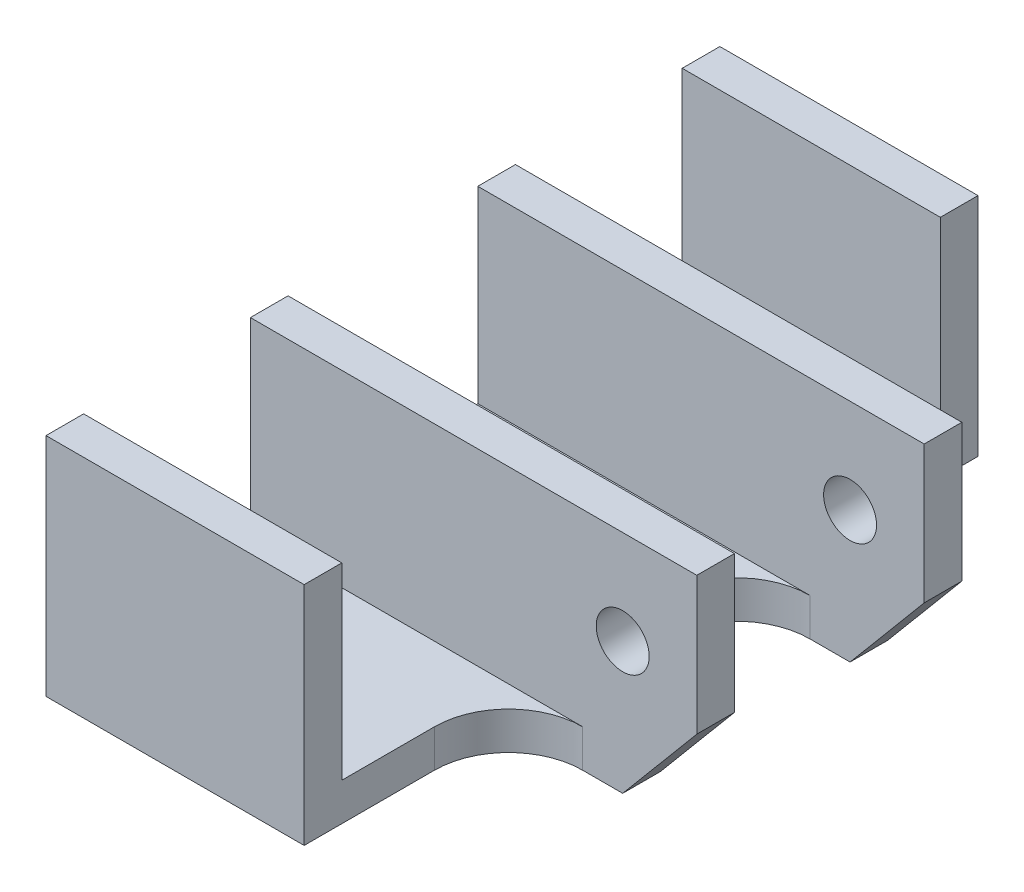
ISO-10303-21;
HEADER;
FILE_DESCRIPTION(('STEP AP214'),'2;1');
FILE_NAME('part.step','',(''),(''),'','','');
FILE_SCHEMA(('AUTOMOTIVE_DESIGN { 1 0 10303 214 1 1 1 1 }'));
ENDSEC;
DATA;
#1=APPLICATION_CONTEXT('core data for automotive mechanical design processes');
#2=APPLICATION_PROTOCOL_DEFINITION('international standard','automotive_design',2000,#1);
#3=PRODUCT_CONTEXT('',#1,'mechanical');
#4=PRODUCT('Part','Part','',(#3));
#5=PRODUCT_RELATED_PRODUCT_CATEGORY('part','',(#4));
#6=PRODUCT_DEFINITION_FORMATION('','',#4);
#7=PRODUCT_DEFINITION_CONTEXT('part definition',#1,'design');
#8=PRODUCT_DEFINITION('design','',#6,#7);
#9=PRODUCT_DEFINITION_SHAPE('','',#8);
#10=(LENGTH_UNIT() NAMED_UNIT(*) SI_UNIT(.MILLI.,.METRE.));
#11=(NAMED_UNIT(*) PLANE_ANGLE_UNIT() SI_UNIT($,.RADIAN.));
#12=(NAMED_UNIT(*) SI_UNIT($,.STERADIAN.) SOLID_ANGLE_UNIT());
#13=UNCERTAINTY_MEASURE_WITH_UNIT(LENGTH_MEASURE(1.E-05),#10,'distance_accuracy_value','');
#14=(GEOMETRIC_REPRESENTATION_CONTEXT(3) GLOBAL_UNCERTAINTY_ASSIGNED_CONTEXT((#13)) GLOBAL_UNIT_ASSIGNED_CONTEXT((#10,
#11,#12)) REPRESENTATION_CONTEXT('',''));
#15=CARTESIAN_POINT('',(0.,0.,0.));
#16=DIRECTION('',(0.,0.,1.));
#17=DIRECTION('',(1.,0.,0.));
#18=AXIS2_PLACEMENT_3D('',#15,#16,#17);
#19=CARTESIAN_POINT('',(34.83,0.,17.88));
#20=DIRECTION('',(0.,0.,-1.));
#21=DIRECTION('',(0.,1.,0.));
#22=AXIS2_PLACEMENT_3D('',#19,#20,#21);
#23=PLANE('',#22);
#24=DIRECTION('',(-1.,0.,0.));
#25=VECTOR('',#24,1.);
#26=CARTESIAN_POINT('',(34.83,0.,17.88));
#27=LINE('',#26,#25);
#28=CARTESIAN_POINT('',(44.83,0.,17.88));
#29=VERTEX_POINT('',#28);
#30=CARTESIAN_POINT('',(0.,0.,17.88));
#31=VERTEX_POINT('',#30);
#32=EDGE_CURVE('E340',#29,#31,#27,.T.);
#33=ORIENTED_EDGE('',*,*,#32,.F.);
#34=DIRECTION('',(0.,-1.,0.));
#35=VECTOR('',#34,1.);
#36=CARTESIAN_POINT('',(44.83,0.,17.88));
#37=LINE('',#36,#35);
#38=CARTESIAN_POINT('',(44.83,-5.08,17.88));
#39=VERTEX_POINT('',#38);
#40=EDGE_CURVE('E385',#29,#39,#37,.T.);
#41=ORIENTED_EDGE('',*,*,#40,.T.);
#42=DIRECTION('',(-1.,0.,0.));
#43=VECTOR('',#42,1.);
#44=CARTESIAN_POINT('',(60.23,-5.08,17.88));
#45=LINE('',#44,#43);
#46=CARTESIAN_POINT('',(50.23,-5.08,17.88));
#47=VERTEX_POINT('',#46);
#48=EDGE_CURVE('E252',#47,#39,#45,.T.);
#49=ORIENTED_EDGE('',*,*,#48,.F.);
#50=DIRECTION('',(-0.642787609686541,-0.766044443118977,0.));
#51=VECTOR('',#50,1.);
#52=CARTESIAN_POINT('',(60.23,6.83753592594208,17.88));
#53=LINE('',#52,#51);
#54=CARTESIAN_POINT('',(60.23,6.83753592594208,17.88));
#55=VERTEX_POINT('',#54);
#56=EDGE_CURVE('E368',#47,#55,#53,.F.);
#57=ORIENTED_EDGE('',*,*,#56,.T.);
#58=DIRECTION('',(0.,-1.,0.));
#59=VECTOR('',#58,1.);
#60=CARTESIAN_POINT('',(60.23,25.4,17.88));
#61=LINE('',#60,#59);
#62=CARTESIAN_POINT('',(60.23,25.4,17.88));
#63=VERTEX_POINT('',#62);
#64=EDGE_CURVE('E241',#63,#55,#61,.T.);
#65=ORIENTED_EDGE('',*,*,#64,.F.);
#66=DIRECTION('',(-1.,0.,0.));
#67=VECTOR('',#66,1.);
#68=CARTESIAN_POINT('',(34.83,25.4,17.88));
#69=LINE('',#68,#67);
#70=CARTESIAN_POINT('',(0.,25.4,17.88));
#71=VERTEX_POINT('',#70);
#72=EDGE_CURVE('E343',#63,#71,#69,.T.);
#73=ORIENTED_EDGE('',*,*,#72,.T.);
#74=DIRECTION('',(0.,-1.,0.));
#75=VECTOR('',#74,1.);
#76=CARTESIAN_POINT('',(0.,0.,17.88));
#77=LINE('',#76,#75);
#78=EDGE_CURVE('E291',#71,#31,#77,.T.);
#79=ORIENTED_EDGE('',*,*,#78,.T.);
#80=EDGE_LOOP('',(#33,#41,#49,#57,#65,#73,#79));
#81=FACE_BOUND('',#80,.T.);
#82=CARTESIAN_POINT('',(50.23,12.7,17.88));
#83=DIRECTION('',(0.,0.,1.));
#84=DIRECTION('',(1.,0.,0.));
#85=AXIS2_PLACEMENT_3D('',#82,#83,#84);
#86=CIRCLE('',#85,3.57123999999999);
#87=CARTESIAN_POINT('',(53.80124,12.7,17.88));
#88=VERTEX_POINT('',#87);
#89=EDGE_CURVE('E446',#88,#88,#86,.T.);
#90=ORIENTED_EDGE('',*,*,#89,.F.);
#91=EDGE_LOOP('',(#90));
#92=FACE_BOUND('',#91,.T.);
#93=ADVANCED_FACE('F35',(#81,#92),#23,.F.);
#94=CARTESIAN_POINT('',(34.83,0.,0.));
#95=DIRECTION('',(1.,0.,0.));
#96=DIRECTION('',(0.,0.,-1.));
#97=AXIS2_PLACEMENT_3D('',#94,#95,#96);
#98=PLANE('',#97);
#99=DIRECTION('',(0.,0.,1.));
#100=VECTOR('',#99,1.);
#101=CARTESIAN_POINT('',(34.83,-5.08,0.));
#102=LINE('',#101,#100);
#103=CARTESIAN_POINT('',(34.83,-5.08,-2.8));
#104=VERTEX_POINT('',#103);
#105=CARTESIAN_POINT('',(34.83,-5.08,2.8));
#106=VERTEX_POINT('',#105);
#107=EDGE_CURVE('E274',#104,#106,#102,.T.);
#108=ORIENTED_EDGE('',*,*,#107,.F.);
#109=DIRECTION('',(0.,1.,0.));
#110=VECTOR('',#109,1.);
#111=CARTESIAN_POINT('',(34.83,0.,-2.8));
#112=LINE('',#111,#110);
#113=CARTESIAN_POINT('',(34.83,0.,-2.8));
#114=VERTEX_POINT('',#113);
#115=EDGE_CURVE('E372',#104,#114,#112,.T.);
#116=ORIENTED_EDGE('',*,*,#115,.T.);
#117=DIRECTION('',(0.,0.,1.));
#118=VECTOR('',#117,1.);
#119=CARTESIAN_POINT('',(34.83,0.,0.));
#120=LINE('',#119,#118);
#121=CARTESIAN_POINT('',(34.83,0.,2.8));
#122=VERTEX_POINT('',#121);
#123=EDGE_CURVE('E255',#114,#122,#120,.T.);
#124=ORIENTED_EDGE('',*,*,#123,.T.);
#125=DIRECTION('',(0.,1.,0.));
#126=VECTOR('',#125,1.);
#127=CARTESIAN_POINT('',(34.83,0.,2.8));
#128=LINE('',#127,#126);
#129=EDGE_CURVE('E370',#122,#106,#128,.F.);
#130=ORIENTED_EDGE('',*,*,#129,.T.);
#131=EDGE_LOOP('',(#108,#116,#124,#130));
#132=FACE_BOUND('',#131,.T.);
#133=ADVANCED_FACE('F420',(#132),#98,.T.);
#134=DIRECTION('',(0.,0.,-1.));
#135=VECTOR('',#134,1.);
#136=CARTESIAN_POINT('',(34.83,0.,0.));
#137=LINE('',#136,#135);
#138=CARTESIAN_POINT('',(34.83,0.,-27.88));
#139=VERTEX_POINT('',#138);
#140=CARTESIAN_POINT('',(34.83,0.,-40.38));
#141=VERTEX_POINT('',#140);
#142=EDGE_CURVE('E281',#139,#141,#137,.T.);
#143=ORIENTED_EDGE('',*,*,#142,.F.);
#144=DIRECTION('',(0.,1.,0.));
#145=VECTOR('',#144,1.);
#146=CARTESIAN_POINT('',(34.83,-5.08,-27.88));
#147=LINE('',#146,#145);
#148=CARTESIAN_POINT('',(34.83,-5.08,-27.88));
#149=VERTEX_POINT('',#148);
#150=EDGE_CURVE('E380',#139,#149,#147,.F.);
#151=ORIENTED_EDGE('',*,*,#150,.T.);
#152=CARTESIAN_POINT('',(34.83,-5.08,-45.46));
#153=VERTEX_POINT('',#152);
#154=EDGE_CURVE('E270',#153,#149,#102,.T.);
#155=ORIENTED_EDGE('',*,*,#154,.F.);
#156=DIRECTION('',(0.,1.,0.));
#157=VECTOR('',#156,1.);
#158=CARTESIAN_POINT('',(34.83,0.,-45.46));
#159=LINE('',#158,#157);
#160=CARTESIAN_POINT('',(34.83,25.4,-45.46));
#161=VERTEX_POINT('',#160);
#162=EDGE_CURVE('E273',#153,#161,#159,.T.);
#163=ORIENTED_EDGE('',*,*,#162,.T.);
#164=DIRECTION('',(0.,0.,1.));
#165=VECTOR('',#164,1.);
#166=CARTESIAN_POINT('',(34.83,25.4,0.));
#167=LINE('',#166,#165);
#168=CARTESIAN_POINT('',(34.83,25.4,-40.38));
#169=VERTEX_POINT('',#168);
#170=EDGE_CURVE('E276',#161,#169,#167,.T.);
#171=ORIENTED_EDGE('',*,*,#170,.T.);
#172=DIRECTION('',(0.,1.,0.));
#173=VECTOR('',#172,1.);
#174=CARTESIAN_POINT('',(34.83,0.,-40.38));
#175=LINE('',#174,#173);
#176=EDGE_CURVE('E278',#141,#169,#175,.T.);
#177=ORIENTED_EDGE('',*,*,#176,.F.);
#178=EDGE_LOOP('',(#143,#151,#155,#163,#171,#177));
#179=FACE_BOUND('',#178,.T.);
#180=ADVANCED_FACE('F479',(#179),#98,.T.);
#181=CARTESIAN_POINT('',(34.83,-5.08,27.88));
#182=VERTEX_POINT('',#181);
#183=CARTESIAN_POINT('',(34.83,-5.08,45.46));
#184=VERTEX_POINT('',#183);
#185=EDGE_CURVE('E269',#182,#184,#102,.T.);
#186=ORIENTED_EDGE('',*,*,#185,.F.);
#187=DIRECTION('',(0.,-1.,0.));
#188=VECTOR('',#187,1.);
#189=CARTESIAN_POINT('',(34.83,0.,27.88));
#190=LINE('',#189,#188);
#191=CARTESIAN_POINT('',(34.83,0.,27.88));
#192=VERTEX_POINT('',#191);
#193=EDGE_CURVE('E56',#182,#192,#190,.F.);
#194=ORIENTED_EDGE('',*,*,#193,.T.);
#195=DIRECTION('',(0.,0.,1.));
#196=VECTOR('',#195,1.);
#197=CARTESIAN_POINT('',(34.83,0.,0.));
#198=LINE('',#197,#196);
#199=CARTESIAN_POINT('',(34.83,0.,40.38));
#200=VERTEX_POINT('',#199);
#201=EDGE_CURVE('E258',#192,#200,#198,.T.);
#202=ORIENTED_EDGE('',*,*,#201,.T.);
#203=DIRECTION('',(0.,1.,0.));
#204=VECTOR('',#203,1.);
#205=CARTESIAN_POINT('',(34.83,0.,40.38));
#206=LINE('',#205,#204);
#207=CARTESIAN_POINT('',(34.83,25.4,40.38));
#208=VERTEX_POINT('',#207);
#209=EDGE_CURVE('E261',#200,#208,#206,.T.);
#210=ORIENTED_EDGE('',*,*,#209,.T.);
#211=DIRECTION('',(0.,0.,-1.));
#212=VECTOR('',#211,1.);
#213=CARTESIAN_POINT('',(34.83,25.4,0.));
#214=LINE('',#213,#212);
#215=CARTESIAN_POINT('',(34.83,25.4,45.46));
#216=VERTEX_POINT('',#215);
#217=EDGE_CURVE('E263',#216,#208,#214,.T.);
#218=ORIENTED_EDGE('',*,*,#217,.F.);
#219=DIRECTION('',(0.,1.,0.));
#220=VECTOR('',#219,1.);
#221=CARTESIAN_POINT('',(34.83,0.,45.46));
#222=LINE('',#221,#220);
#223=EDGE_CURVE('E266',#184,#216,#222,.T.);
#224=ORIENTED_EDGE('',*,*,#223,.F.);
#225=EDGE_LOOP('',(#186,#194,#202,#210,#218,#224));
#226=FACE_BOUND('',#225,.T.);
#227=ADVANCED_FACE('F481',(#226),#98,.T.);
#228=CARTESIAN_POINT('',(34.83,0.,-12.8));
#229=DIRECTION('',(0.,0.,1.));
#230=DIRECTION('',(0.,-1.,0.));
#231=AXIS2_PLACEMENT_3D('',#228,#229,#230);
#232=PLANE('',#231);
#233=CARTESIAN_POINT('',(50.23,12.7,-12.8));
#234=DIRECTION('',(0.,0.,1.));
#235=DIRECTION('',(0.,-1.,0.));
#236=AXIS2_PLACEMENT_3D('',#233,#234,#235);
#237=CIRCLE('',#236,3.57123999999999);
#238=CARTESIAN_POINT('',(50.23,9.12876000000001,-12.8));
#239=VERTEX_POINT('',#238);
#240=EDGE_CURVE('E443',#239,#239,#237,.T.);
#241=ORIENTED_EDGE('',*,*,#240,.F.);
#242=EDGE_LOOP('',(#241));
#243=FACE_BOUND('',#242,.T.);
#244=DIRECTION('',(-1.,0.,0.));
#245=VECTOR('',#244,1.);
#246=CARTESIAN_POINT('',(34.83,0.,-12.8));
#247=LINE('',#246,#245);
#248=CARTESIAN_POINT('',(44.83,0.,-12.8));
#249=VERTEX_POINT('',#248);
#250=CARTESIAN_POINT('',(0.,0.,-12.8));
#251=VERTEX_POINT('',#250);
#252=EDGE_CURVE('E352',#249,#251,#247,.T.);
#253=ORIENTED_EDGE('',*,*,#252,.F.);
#254=DIRECTION('',(0.,1.,0.));
#255=VECTOR('',#254,1.);
#256=CARTESIAN_POINT('',(44.83,-5.08,-12.8));
#257=LINE('',#256,#255);
#258=CARTESIAN_POINT('',(44.83,-5.08,-12.8));
#259=VERTEX_POINT('',#258);
#260=EDGE_CURVE('E375',#249,#259,#257,.F.);
#261=ORIENTED_EDGE('',*,*,#260,.T.);
#262=DIRECTION('',(-1.,0.,0.));
#263=VECTOR('',#262,1.);
#264=CARTESIAN_POINT('',(60.23,-5.08,-12.8));
#265=LINE('',#264,#263);
#266=CARTESIAN_POINT('',(50.23,-5.08,-12.8));
#267=VERTEX_POINT('',#266);
#268=EDGE_CURVE('E235',#267,#259,#265,.T.);
#269=ORIENTED_EDGE('',*,*,#268,.F.);
#270=DIRECTION('',(-0.642787609686541,-0.766044443118977,0.));
#271=VECTOR('',#270,1.);
#272=CARTESIAN_POINT('',(46.3685026606863,-9.68195332692001,-12.8));
#273=LINE('',#272,#271);
#274=CARTESIAN_POINT('',(60.23,6.83753592594208,-12.8));
#275=VERTEX_POINT('',#274);
#276=EDGE_CURVE('E361',#267,#275,#273,.F.);
#277=ORIENTED_EDGE('',*,*,#276,.T.);
#278=DIRECTION('',(0.,-1.,0.));
#279=VECTOR('',#278,1.);
#280=CARTESIAN_POINT('',(60.23,25.4,-12.8));
#281=LINE('',#280,#279);
#282=CARTESIAN_POINT('',(60.23,25.4,-12.8));
#283=VERTEX_POINT('',#282);
#284=EDGE_CURVE('E218',#283,#275,#281,.T.);
#285=ORIENTED_EDGE('',*,*,#284,.F.);
#286=DIRECTION('',(-1.,0.,0.));
#287=VECTOR('',#286,1.);
#288=CARTESIAN_POINT('',(34.83,25.4,-12.8));
#289=LINE('',#288,#287);
#290=CARTESIAN_POINT('',(0.,25.4,-12.8));
#291=VERTEX_POINT('',#290);
#292=EDGE_CURVE('E230',#283,#291,#289,.T.);
#293=ORIENTED_EDGE('',*,*,#292,.T.);
#294=DIRECTION('',(0.,1.,0.));
#295=VECTOR('',#294,1.);
#296=CARTESIAN_POINT('',(0.,0.,-12.8));
#297=LINE('',#296,#295);
#298=EDGE_CURVE('E254',#251,#291,#297,.T.);
#299=ORIENTED_EDGE('',*,*,#298,.F.);
#300=EDGE_LOOP('',(#253,#261,#269,#277,#285,#293,#299));
#301=FACE_BOUND('',#300,.T.);
#302=ADVANCED_FACE('F433',(#243,#301),#232,.T.);
#303=CARTESIAN_POINT('',(34.83,0.,0.));
#304=DIRECTION('',(0.,-1.,0.));
#305=DIRECTION('',(0.,0.,-1.));
#306=AXIS2_PLACEMENT_3D('',#303,#304,#305);
#307=PLANE('',#306);
#308=CARTESIAN_POINT('',(17.415,0.,0.));
#309=DIRECTION('',(0.,-1.,0.));
#310=DIRECTION('',(0.,0.,-1.));
#311=AXIS2_PLACEMENT_3D('',#308,#309,#310);
#312=CIRCLE('',#311,3.57123999999999);
#313=CARTESIAN_POINT('',(17.415,0.,-3.57123999999999));
#314=VERTEX_POINT('',#313);
#315=EDGE_CURVE('E449',#314,#314,#312,.T.);
#316=ORIENTED_EDGE('',*,*,#315,.T.);
#317=EDGE_LOOP('',(#316));
#318=FACE_BOUND('',#317,.T.);
#319=DIRECTION('',(0.,0.,1.));
#320=VECTOR('',#319,1.);
#321=CARTESIAN_POINT('',(0.,0.,0.));
#322=LINE('',#321,#320);
#323=CARTESIAN_POINT('',(0.,0.,12.8));
#324=VERTEX_POINT('',#323);
#325=EDGE_CURVE('E285',#251,#324,#322,.T.);
#326=ORIENTED_EDGE('',*,*,#325,.T.);
#327=DIRECTION('',(-1.,0.,0.));
#328=VECTOR('',#327,1.);
#329=CARTESIAN_POINT('',(34.83,0.,12.8));
#330=LINE('',#329,#328);
#331=CARTESIAN_POINT('',(44.83,0.,12.8));
#332=VERTEX_POINT('',#331);
#333=EDGE_CURVE('E349',#332,#324,#330,.T.);
#334=ORIENTED_EDGE('',*,*,#333,.F.);
#335=CARTESIAN_POINT('',(44.83,0.,2.8));
#336=DIRECTION('',(0.,-1.,0.));
#337=DIRECTION('',(0.,0.,-1.));
#338=AXIS2_PLACEMENT_3D('',#335,#336,#337);
#339=CIRCLE('',#338,10.);
#340=EDGE_CURVE('E398',#332,#122,#339,.T.);
#341=ORIENTED_EDGE('',*,*,#340,.T.);
#342=ORIENTED_EDGE('',*,*,#123,.F.);
#343=CARTESIAN_POINT('',(44.83,0.,-2.8));
#344=DIRECTION('',(0.,-1.,0.));
#345=DIRECTION('',(0.,0.,-1.));
#346=AXIS2_PLACEMENT_3D('',#343,#344,#345);
#347=CIRCLE('',#346,10.);
#348=EDGE_CURVE('E389',#114,#249,#347,.T.);
#349=ORIENTED_EDGE('',*,*,#348,.T.);
#350=ORIENTED_EDGE('',*,*,#252,.T.);
#351=EDGE_LOOP('',(#326,#334,#341,#342,#349,#350));
#352=FACE_BOUND('',#351,.T.);
#353=ADVANCED_FACE('F418',(#318,#352),#307,.F.);
#354=CARTESIAN_POINT('',(34.83,0.,12.8));
#355=DIRECTION('',(0.,0.,1.));
#356=DIRECTION('',(0.,-1.,0.));
#357=AXIS2_PLACEMENT_3D('',#354,#355,#356);
#358=PLANE('',#357);
#359=CARTESIAN_POINT('',(50.23,12.7,12.8));
#360=DIRECTION('',(0.,0.,1.));
#361=DIRECTION('',(0.,-1.,0.));
#362=AXIS2_PLACEMENT_3D('',#359,#360,#361);
#363=CIRCLE('',#362,3.57123999999999);
#364=CARTESIAN_POINT('',(50.23,9.12876000000001,12.8));
#365=VERTEX_POINT('',#364);
#366=EDGE_CURVE('E436',#365,#365,#363,.T.);
#367=ORIENTED_EDGE('',*,*,#366,.T.);
#368=EDGE_LOOP('',(#367));
#369=FACE_BOUND('',#368,.T.);
#370=DIRECTION('',(-1.,0.,0.));
#371=VECTOR('',#370,1.);
#372=CARTESIAN_POINT('',(60.23,-5.08,12.8));
#373=LINE('',#372,#371);
#374=CARTESIAN_POINT('',(50.23,-5.08,12.8));
#375=VERTEX_POINT('',#374);
#376=CARTESIAN_POINT('',(44.83,-5.08,12.8));
#377=VERTEX_POINT('',#376);
#378=EDGE_CURVE('E249',#375,#377,#373,.T.);
#379=ORIENTED_EDGE('',*,*,#378,.T.);
#380=DIRECTION('',(0.,1.,0.));
#381=VECTOR('',#380,1.);
#382=CARTESIAN_POINT('',(44.83,0.,12.8));
#383=LINE('',#382,#381);
#384=EDGE_CURVE('E382',#377,#332,#383,.T.);
#385=ORIENTED_EDGE('',*,*,#384,.T.);
#386=ORIENTED_EDGE('',*,*,#333,.T.);
#387=DIRECTION('',(0.,1.,0.));
#388=VECTOR('',#387,1.);
#389=CARTESIAN_POINT('',(0.,0.,12.8));
#390=LINE('',#389,#388);
#391=CARTESIAN_POINT('',(0.,25.4,12.8));
#392=VERTEX_POINT('',#391);
#393=EDGE_CURVE('E287',#324,#392,#390,.T.);
#394=ORIENTED_EDGE('',*,*,#393,.T.);
#395=DIRECTION('',(-1.,0.,0.));
#396=VECTOR('',#395,1.);
#397=CARTESIAN_POINT('',(34.83,25.4,12.8));
#398=LINE('',#397,#396);
#399=CARTESIAN_POINT('',(60.23,25.4,12.8));
#400=VERTEX_POINT('',#399);
#401=EDGE_CURVE('E346',#400,#392,#398,.T.);
#402=ORIENTED_EDGE('',*,*,#401,.F.);
#403=DIRECTION('',(0.,1.,0.));
#404=VECTOR('',#403,1.);
#405=CARTESIAN_POINT('',(60.23,25.4,12.8));
#406=LINE('',#405,#404);
#407=CARTESIAN_POINT('',(60.23,6.83753592594208,12.8));
#408=VERTEX_POINT('',#407);
#409=EDGE_CURVE('E244',#408,#400,#406,.T.);
#410=ORIENTED_EDGE('',*,*,#409,.F.);
#411=DIRECTION('',(0.642787609686541,0.766044443118977,0.));
#412=VECTOR('',#411,1.);
#413=CARTESIAN_POINT('',(60.23,6.83753592594208,12.8));
#414=LINE('',#413,#412);
#415=EDGE_CURVE('E366',#408,#375,#414,.F.);
#416=ORIENTED_EDGE('',*,*,#415,.T.);
#417=EDGE_LOOP('',(#379,#385,#386,#394,#402,#410,#416));
#418=FACE_BOUND('',#417,.T.);
#419=ADVANCED_FACE('F412',(#369,#418),#358,.F.);
#420=CARTESIAN_POINT('',(34.83,25.4,0.));
#421=DIRECTION('',(0.,-1.,0.));
#422=DIRECTION('',(0.,0.,-1.));
#423=AXIS2_PLACEMENT_3D('',#420,#421,#422);
#424=PLANE('',#423);
#425=DIRECTION('',(0.,0.,1.));
#426=VECTOR('',#425,1.);
#427=CARTESIAN_POINT('',(0.,25.4,0.));
#428=LINE('',#427,#426);
#429=EDGE_CURVE('E289',#392,#71,#428,.T.);
#430=ORIENTED_EDGE('',*,*,#429,.T.);
#431=ORIENTED_EDGE('',*,*,#72,.F.);
#432=DIRECTION('',(0.,0.,1.));
#433=VECTOR('',#432,1.);
#434=CARTESIAN_POINT('',(60.23,25.4,17.88));
#435=LINE('',#434,#433);
#436=EDGE_CURVE('E246',#400,#63,#435,.T.);
#437=ORIENTED_EDGE('',*,*,#436,.F.);
#438=ORIENTED_EDGE('',*,*,#401,.T.);
#439=EDGE_LOOP('',(#430,#431,#437,#438));
#440=FACE_BOUND('',#439,.T.);
#441=ADVANCED_FACE('F487',(#440),#424,.F.);
#442=CARTESIAN_POINT('',(34.83,0.,0.));
#443=DIRECTION('',(0.,-1.,0.));
#444=DIRECTION('',(0.,0.,-1.));
#445=AXIS2_PLACEMENT_3D('',#442,#443,#444);
#446=PLANE('',#445);
#447=DIRECTION('',(0.,0.,1.));
#448=VECTOR('',#447,1.);
#449=CARTESIAN_POINT('',(0.,0.,0.));
#450=LINE('',#449,#448);
#451=CARTESIAN_POINT('',(0.,0.,40.38));
#452=VERTEX_POINT('',#451);
#453=EDGE_CURVE('E293',#31,#452,#450,.T.);
#454=ORIENTED_EDGE('',*,*,#453,.T.);
#455=DIRECTION('',(-1.,0.,0.));
#456=VECTOR('',#455,1.);
#457=CARTESIAN_POINT('',(34.83,0.,40.38));
#458=LINE('',#457,#456);
#459=EDGE_CURVE('E337',#200,#452,#458,.T.);
#460=ORIENTED_EDGE('',*,*,#459,.F.);
#461=ORIENTED_EDGE('',*,*,#201,.F.);
#462=CARTESIAN_POINT('',(44.83,0.,27.88));
#463=DIRECTION('',(0.,-1.,0.));
#464=DIRECTION('',(0.,0.,-1.));
#465=AXIS2_PLACEMENT_3D('',#462,#463,#464);
#466=CIRCLE('',#465,10.);
#467=EDGE_CURVE('E11',#192,#29,#466,.T.);
#468=ORIENTED_EDGE('',*,*,#467,.T.);
#469=ORIENTED_EDGE('',*,*,#32,.T.);
#470=EDGE_LOOP('',(#454,#460,#461,#468,#469));
#471=FACE_BOUND('',#470,.T.);
#472=ADVANCED_FACE('F485',(#471),#446,.F.);
#473=CARTESIAN_POINT('',(34.83,0.,40.38));
#474=DIRECTION('',(0.,0.,1.));
#475=DIRECTION('',(0.,-1.,0.));
#476=AXIS2_PLACEMENT_3D('',#473,#474,#475);
#477=PLANE('',#476);
#478=DIRECTION('',(0.,1.,0.));
#479=VECTOR('',#478,1.);
#480=CARTESIAN_POINT('',(0.,0.,40.38));
#481=LINE('',#480,#479);
#482=CARTESIAN_POINT('',(0.,25.4,40.38));
#483=VERTEX_POINT('',#482);
#484=EDGE_CURVE('E295',#452,#483,#481,.T.);
#485=ORIENTED_EDGE('',*,*,#484,.T.);
#486=DIRECTION('',(-1.,0.,0.));
#487=VECTOR('',#486,1.);
#488=CARTESIAN_POINT('',(34.83,25.4,40.38));
#489=LINE('',#488,#487);
#490=EDGE_CURVE('E335',#208,#483,#489,.T.);
#491=ORIENTED_EDGE('',*,*,#490,.F.);
#492=ORIENTED_EDGE('',*,*,#209,.F.);
#493=ORIENTED_EDGE('',*,*,#459,.T.);
#494=EDGE_LOOP('',(#485,#491,#492,#493));
#495=FACE_BOUND('',#494,.T.);
#496=ADVANCED_FACE('F533',(#495),#477,.F.);
#497=CARTESIAN_POINT('',(34.83,25.4,0.));
#498=DIRECTION('',(0.,1.,0.));
#499=DIRECTION('',(0.,0.,1.));
#500=AXIS2_PLACEMENT_3D('',#497,#498,#499);
#501=PLANE('',#500);
#502=DIRECTION('',(0.,0.,-1.));
#503=VECTOR('',#502,1.);
#504=CARTESIAN_POINT('',(0.,25.4,0.));
#505=LINE('',#504,#503);
#506=CARTESIAN_POINT('',(0.,25.4,45.46));
#507=VERTEX_POINT('',#506);
#508=EDGE_CURVE('E298',#507,#483,#505,.T.);
#509=ORIENTED_EDGE('',*,*,#508,.F.);
#510=DIRECTION('',(-1.,0.,0.));
#511=VECTOR('',#510,1.);
#512=CARTESIAN_POINT('',(34.83,25.4,45.46));
#513=LINE('',#512,#511);
#514=EDGE_CURVE('E333',#216,#507,#513,.T.);
#515=ORIENTED_EDGE('',*,*,#514,.F.);
#516=ORIENTED_EDGE('',*,*,#217,.T.);
#517=ORIENTED_EDGE('',*,*,#490,.T.);
#518=EDGE_LOOP('',(#509,#515,#516,#517));
#519=FACE_BOUND('',#518,.T.);
#520=ADVANCED_FACE('F470',(#519),#501,.T.);
#521=CARTESIAN_POINT('',(34.83,0.,45.46));
#522=DIRECTION('',(0.,0.,1.));
#523=DIRECTION('',(0.,-1.,0.));
#524=AXIS2_PLACEMENT_3D('',#521,#522,#523);
#525=PLANE('',#524);
#526=DIRECTION('',(0.,1.,0.));
#527=VECTOR('',#526,1.);
#528=CARTESIAN_POINT('',(0.,0.,45.46));
#529=LINE('',#528,#527);
#530=CARTESIAN_POINT('',(0.,-5.08,45.46));
#531=VERTEX_POINT('',#530);
#532=EDGE_CURVE('E301',#531,#507,#529,.T.);
#533=ORIENTED_EDGE('',*,*,#532,.F.);
#534=DIRECTION('',(-1.,0.,0.));
#535=VECTOR('',#534,1.);
#536=CARTESIAN_POINT('',(34.83,-5.08,45.46));
#537=LINE('',#536,#535);
#538=EDGE_CURVE('E331',#184,#531,#537,.T.);
#539=ORIENTED_EDGE('',*,*,#538,.F.);
#540=ORIENTED_EDGE('',*,*,#223,.T.);
#541=ORIENTED_EDGE('',*,*,#514,.T.);
#542=EDGE_LOOP('',(#533,#539,#540,#541));
#543=FACE_BOUND('',#542,.T.);
#544=ADVANCED_FACE('F461',(#543),#525,.T.);
#545=CARTESIAN_POINT('',(34.83,-5.08,0.));
#546=DIRECTION('',(0.,-1.,0.));
#547=DIRECTION('',(0.,0.,-1.));
#548=AXIS2_PLACEMENT_3D('',#545,#546,#547);
#549=PLANE('',#548);
#550=CARTESIAN_POINT('',(17.415,-5.08,0.));
#551=DIRECTION('',(0.,-1.,0.));
#552=DIRECTION('',(0.,0.,-1.));
#553=AXIS2_PLACEMENT_3D('',#550,#551,#552);
#554=CIRCLE('',#553,3.57123999999999);
#555=CARTESIAN_POINT('',(17.415,-5.08,-3.57123999999999));
#556=VERTEX_POINT('',#555);
#557=EDGE_CURVE('E452',#556,#556,#554,.T.);
#558=ORIENTED_EDGE('',*,*,#557,.F.);
#559=EDGE_LOOP('',(#558));
#560=FACE_BOUND('',#559,.T.);
#561=DIRECTION('',(-1.,0.,0.));
#562=VECTOR('',#561,1.);
#563=CARTESIAN_POINT('',(60.23,-5.08,-17.88));
#564=LINE('',#563,#562);
#565=CARTESIAN_POINT('',(50.23,-5.08,-17.88));
#566=VERTEX_POINT('',#565);
#567=CARTESIAN_POINT('',(44.83,-5.08,-17.88));
#568=VERTEX_POINT('',#567);
#569=EDGE_CURVE('E233',#566,#568,#564,.T.);
#570=ORIENTED_EDGE('',*,*,#569,.F.);
#571=DIRECTION('',(0.,0.,1.));
#572=VECTOR('',#571,1.);
#573=CARTESIAN_POINT('',(50.23,-5.08,0.));
#574=LINE('',#573,#572);
#575=EDGE_CURVE('E359',#566,#267,#574,.T.);
#576=ORIENTED_EDGE('',*,*,#575,.T.);
#577=ORIENTED_EDGE('',*,*,#268,.T.);
#578=CARTESIAN_POINT('',(44.83,-5.08,-2.8));
#579=DIRECTION('',(0.,-1.,0.));
#580=DIRECTION('',(0.,0.,-1.));
#581=AXIS2_PLACEMENT_3D('',#578,#579,#580);
#582=CIRCLE('',#581,10.);
#583=EDGE_CURVE('E392',#259,#104,#582,.F.);
#584=ORIENTED_EDGE('',*,*,#583,.T.);
#585=ORIENTED_EDGE('',*,*,#107,.T.);
#586=CARTESIAN_POINT('',(44.83,-5.08,2.8));
#587=DIRECTION('',(0.,-1.,0.));
#588=DIRECTION('',(0.,0.,-1.));
#589=AXIS2_PLACEMENT_3D('',#586,#587,#588);
#590=CIRCLE('',#589,10.);
#591=EDGE_CURVE('E400',#106,#377,#590,.F.);
#592=ORIENTED_EDGE('',*,*,#591,.T.);
#593=ORIENTED_EDGE('',*,*,#378,.F.);
#594=DIRECTION('',(0.,0.,1.));
#595=VECTOR('',#594,1.);
#596=CARTESIAN_POINT('',(50.23,-5.08,0.));
#597=LINE('',#596,#595);
#598=EDGE_CURVE('E357',#375,#47,#597,.T.);
#599=ORIENTED_EDGE('',*,*,#598,.T.);
#600=ORIENTED_EDGE('',*,*,#48,.T.);
#601=CARTESIAN_POINT('',(44.83,-5.08,27.88));
#602=DIRECTION('',(0.,-1.,0.));
#603=DIRECTION('',(0.,0.,-1.));
#604=AXIS2_PLACEMENT_3D('',#601,#602,#603);
#605=CIRCLE('',#604,10.);
#606=EDGE_CURVE('E43',#39,#182,#605,.F.);
#607=ORIENTED_EDGE('',*,*,#606,.T.);
#608=ORIENTED_EDGE('',*,*,#185,.T.);
#609=ORIENTED_EDGE('',*,*,#538,.T.);
#610=DIRECTION('',(0.,0.,1.));
#611=VECTOR('',#610,1.);
#612=CARTESIAN_POINT('',(0.,-5.08,0.));
#613=LINE('',#612,#611);
#614=CARTESIAN_POINT('',(0.,-5.08,-45.46));
#615=VERTEX_POINT('',#614);
#616=EDGE_CURVE('E304',#615,#531,#613,.T.);
#617=ORIENTED_EDGE('',*,*,#616,.F.);
#618=DIRECTION('',(-1.,0.,0.));
#619=VECTOR('',#618,1.);
#620=CARTESIAN_POINT('',(34.83,-5.08,-45.46));
#621=LINE('',#620,#619);
#622=EDGE_CURVE('E329',#153,#615,#621,.T.);
#623=ORIENTED_EDGE('',*,*,#622,.F.);
#624=ORIENTED_EDGE('',*,*,#154,.T.);
#625=CARTESIAN_POINT('',(44.83,-5.08,-27.88));
#626=DIRECTION('',(0.,-1.,0.));
#627=DIRECTION('',(0.,0.,-1.));
#628=AXIS2_PLACEMENT_3D('',#625,#626,#627);
#629=CIRCLE('',#628,10.);
#630=EDGE_CURVE('E396',#149,#568,#629,.F.);
#631=ORIENTED_EDGE('',*,*,#630,.T.);
#632=EDGE_LOOP('',(#570,#576,#577,#584,#585,#592,#593,#599,#600,#607,#608,#609,#617,#623,#624,#631));
#633=FACE_BOUND('',#632,.T.);
#634=ADVANCED_FACE('F405',(#560,#633),#549,.T.);
#635=CARTESIAN_POINT('',(34.83,0.,-45.46));
#636=DIRECTION('',(0.,0.,1.));
#637=DIRECTION('',(0.,-1.,0.));
#638=AXIS2_PLACEMENT_3D('',#635,#636,#637);
#639=PLANE('',#638);
#640=DIRECTION('',(0.,1.,0.));
#641=VECTOR('',#640,1.);
#642=CARTESIAN_POINT('',(0.,0.,-45.46));
#643=LINE('',#642,#641);
#644=CARTESIAN_POINT('',(0.,25.4,-45.46));
#645=VERTEX_POINT('',#644);
#646=EDGE_CURVE('E307',#615,#645,#643,.T.);
#647=ORIENTED_EDGE('',*,*,#646,.T.);
#648=DIRECTION('',(-1.,0.,0.));
#649=VECTOR('',#648,1.);
#650=CARTESIAN_POINT('',(34.83,25.4,-45.46));
#651=LINE('',#650,#649);
#652=EDGE_CURVE('E326',#161,#645,#651,.T.);
#653=ORIENTED_EDGE('',*,*,#652,.F.);
#654=ORIENTED_EDGE('',*,*,#162,.F.);
#655=ORIENTED_EDGE('',*,*,#622,.T.);
#656=EDGE_LOOP('',(#647,#653,#654,#655));
#657=FACE_BOUND('',#656,.T.);
#658=ADVANCED_FACE('F460',(#657),#639,.F.);
#659=CARTESIAN_POINT('',(34.83,25.4,0.));
#660=DIRECTION('',(0.,-1.,0.));
#661=DIRECTION('',(0.,0.,-1.));
#662=AXIS2_PLACEMENT_3D('',#659,#660,#661);
#663=PLANE('',#662);
#664=DIRECTION('',(0.,0.,1.));
#665=VECTOR('',#664,1.);
#666=CARTESIAN_POINT('',(0.,25.4,0.));
#667=LINE('',#666,#665);
#668=CARTESIAN_POINT('',(0.,25.4,-40.38));
#669=VERTEX_POINT('',#668);
#670=EDGE_CURVE('E309',#645,#669,#667,.T.);
#671=ORIENTED_EDGE('',*,*,#670,.T.);
#672=DIRECTION('',(-1.,0.,0.));
#673=VECTOR('',#672,1.);
#674=CARTESIAN_POINT('',(34.83,25.4,-40.38));
#675=LINE('',#674,#673);
#676=EDGE_CURVE('E324',#169,#669,#675,.T.);
#677=ORIENTED_EDGE('',*,*,#676,.F.);
#678=ORIENTED_EDGE('',*,*,#170,.F.);
#679=ORIENTED_EDGE('',*,*,#652,.T.);
#680=EDGE_LOOP('',(#671,#677,#678,#679));
#681=FACE_BOUND('',#680,.T.);
#682=ADVANCED_FACE('F467',(#681),#663,.F.);
#683=CARTESIAN_POINT('',(34.83,0.,-40.38));
#684=DIRECTION('',(0.,0.,1.));
#685=DIRECTION('',(0.,-1.,0.));
#686=AXIS2_PLACEMENT_3D('',#683,#684,#685);
#687=PLANE('',#686);
#688=DIRECTION('',(0.,1.,0.));
#689=VECTOR('',#688,1.);
#690=CARTESIAN_POINT('',(0.,0.,-40.38));
#691=LINE('',#690,#689);
#692=CARTESIAN_POINT('',(0.,0.,-40.38));
#693=VERTEX_POINT('',#692);
#694=EDGE_CURVE('E312',#693,#669,#691,.T.);
#695=ORIENTED_EDGE('',*,*,#694,.F.);
#696=DIRECTION('',(-1.,0.,0.));
#697=VECTOR('',#696,1.);
#698=CARTESIAN_POINT('',(34.83,0.,-40.38));
#699=LINE('',#698,#697);
#700=EDGE_CURVE('E322',#141,#693,#699,.T.);
#701=ORIENTED_EDGE('',*,*,#700,.F.);
#702=ORIENTED_EDGE('',*,*,#176,.T.);
#703=ORIENTED_EDGE('',*,*,#676,.T.);
#704=EDGE_LOOP('',(#695,#701,#702,#703));
#705=FACE_BOUND('',#704,.T.);
#706=ADVANCED_FACE('F562',(#705),#687,.T.);
#707=CARTESIAN_POINT('',(34.83,0.,0.));
#708=DIRECTION('',(0.,1.,0.));
#709=DIRECTION('',(0.,0.,1.));
#710=AXIS2_PLACEMENT_3D('',#707,#708,#709);
#711=PLANE('',#710);
#712=DIRECTION('',(0.,0.,-1.));
#713=VECTOR('',#712,1.);
#714=CARTESIAN_POINT('',(0.,0.,0.));
#715=LINE('',#714,#713);
#716=CARTESIAN_POINT('',(0.,0.,-17.88));
#717=VERTEX_POINT('',#716);
#718=EDGE_CURVE('E315',#717,#693,#715,.T.);
#719=ORIENTED_EDGE('',*,*,#718,.F.);
#720=DIRECTION('',(-1.,0.,0.));
#721=VECTOR('',#720,1.);
#722=CARTESIAN_POINT('',(34.83,0.,-17.88));
#723=LINE('',#722,#721);
#724=CARTESIAN_POINT('',(44.83,0.,-17.88));
#725=VERTEX_POINT('',#724);
#726=EDGE_CURVE('E229',#725,#717,#723,.T.);
#727=ORIENTED_EDGE('',*,*,#726,.F.);
#728=CARTESIAN_POINT('',(44.83,0.,-27.88));
#729=DIRECTION('',(0.,1.,0.));
#730=DIRECTION('',(0.,0.,1.));
#731=AXIS2_PLACEMENT_3D('',#728,#729,#730);
#732=CIRCLE('',#731,10.);
#733=EDGE_CURVE('E394',#725,#139,#732,.F.);
#734=ORIENTED_EDGE('',*,*,#733,.T.);
#735=ORIENTED_EDGE('',*,*,#142,.T.);
#736=ORIENTED_EDGE('',*,*,#700,.T.);
#737=EDGE_LOOP('',(#719,#727,#734,#735,#736));
#738=FACE_BOUND('',#737,.T.);
#739=ADVANCED_FACE('F558',(#738),#711,.T.);
#740=CARTESIAN_POINT('',(34.83,0.,-17.88));
#741=DIRECTION('',(0.,0.,-1.));
#742=DIRECTION('',(0.,1.,0.));
#743=AXIS2_PLACEMENT_3D('',#740,#741,#742);
#744=PLANE('',#743);
#745=CARTESIAN_POINT('',(50.23,12.7,-17.88));
#746=DIRECTION('',(0.,0.,-1.));
#747=DIRECTION('',(0.,1.,0.));
#748=AXIS2_PLACEMENT_3D('',#745,#746,#747);
#749=CIRCLE('',#748,3.57123999999999);
#750=CARTESIAN_POINT('',(50.23,16.27124,-17.88));
#751=VERTEX_POINT('',#750);
#752=EDGE_CURVE('E438',#751,#751,#749,.T.);
#753=ORIENTED_EDGE('',*,*,#752,.F.);
#754=EDGE_LOOP('',(#753));
#755=FACE_BOUND('',#754,.T.);
#756=ORIENTED_EDGE('',*,*,#569,.T.);
#757=DIRECTION('',(0.,1.,0.));
#758=VECTOR('',#757,1.);
#759=CARTESIAN_POINT('',(44.83,0.,-17.88));
#760=LINE('',#759,#758);
#761=EDGE_CURVE('E377',#568,#725,#760,.T.);
#762=ORIENTED_EDGE('',*,*,#761,.T.);
#763=ORIENTED_EDGE('',*,*,#726,.T.);
#764=DIRECTION('',(0.,-1.,0.));
#765=VECTOR('',#764,1.);
#766=CARTESIAN_POINT('',(0.,0.,-17.88));
#767=LINE('',#766,#765);
#768=CARTESIAN_POINT('',(0.,25.4,-17.88));
#769=VERTEX_POINT('',#768);
#770=EDGE_CURVE('E225',#769,#717,#767,.T.);
#771=ORIENTED_EDGE('',*,*,#770,.F.);
#772=DIRECTION('',(-1.,0.,0.));
#773=VECTOR('',#772,1.);
#774=CARTESIAN_POINT('',(34.83,25.4,-17.88));
#775=LINE('',#774,#773);
#776=CARTESIAN_POINT('',(60.23,25.4,-17.88));
#777=VERTEX_POINT('',#776);
#778=EDGE_CURVE('E221',#777,#769,#775,.T.);
#779=ORIENTED_EDGE('',*,*,#778,.F.);
#780=DIRECTION('',(0.,1.,0.));
#781=VECTOR('',#780,1.);
#782=CARTESIAN_POINT('',(60.23,25.4,-17.88));
#783=LINE('',#782,#781);
#784=CARTESIAN_POINT('',(60.23,6.83753592594208,-17.88));
#785=VERTEX_POINT('',#784);
#786=EDGE_CURVE('E208',#785,#777,#783,.T.);
#787=ORIENTED_EDGE('',*,*,#786,.F.);
#788=DIRECTION('',(0.642787609686541,0.766044443118977,0.));
#789=VECTOR('',#788,1.);
#790=CARTESIAN_POINT('',(46.3685026606863,-9.68195332692,-17.88));
#791=LINE('',#790,#789);
#792=EDGE_CURVE('E355',#785,#566,#791,.F.);
#793=ORIENTED_EDGE('',*,*,#792,.T.);
#794=EDGE_LOOP('',(#756,#762,#763,#771,#779,#787,#793));
#795=FACE_BOUND('',#794,.T.);
#796=ADVANCED_FACE('F223',(#755,#795),#744,.T.);
#797=CARTESIAN_POINT('',(34.83,25.4,0.));
#798=DIRECTION('',(0.,1.,0.));
#799=DIRECTION('',(0.,0.,1.));
#800=AXIS2_PLACEMENT_3D('',#797,#798,#799);
#801=PLANE('',#800);
#802=DIRECTION('',(0.,0.,-1.));
#803=VECTOR('',#802,1.);
#804=CARTESIAN_POINT('',(0.,25.4,0.));
#805=LINE('',#804,#803);
#806=EDGE_CURVE('E259',#291,#769,#805,.T.);
#807=ORIENTED_EDGE('',*,*,#806,.F.);
#808=ORIENTED_EDGE('',*,*,#292,.F.);
#809=DIRECTION('',(0.,0.,1.));
#810=VECTOR('',#809,1.);
#811=CARTESIAN_POINT('',(60.23,25.4,-12.8));
#812=LINE('',#811,#810);
#813=EDGE_CURVE('E213',#777,#283,#812,.T.);
#814=ORIENTED_EDGE('',*,*,#813,.F.);
#815=ORIENTED_EDGE('',*,*,#778,.T.);
#816=EDGE_LOOP('',(#807,#808,#814,#815));
#817=FACE_BOUND('',#816,.T.);
#818=ADVANCED_FACE('F232',(#817),#801,.T.);
#819=CARTESIAN_POINT('',(0.,0.,0.));
#820=DIRECTION('',(1.,0.,0.));
#821=DIRECTION('',(0.,0.,-1.));
#822=AXIS2_PLACEMENT_3D('',#819,#820,#821);
#823=PLANE('',#822);
#824=ORIENTED_EDGE('',*,*,#298,.T.);
#825=ORIENTED_EDGE('',*,*,#806,.T.);
#826=ORIENTED_EDGE('',*,*,#770,.T.);
#827=ORIENTED_EDGE('',*,*,#718,.T.);
#828=ORIENTED_EDGE('',*,*,#694,.T.);
#829=ORIENTED_EDGE('',*,*,#670,.F.);
#830=ORIENTED_EDGE('',*,*,#646,.F.);
#831=ORIENTED_EDGE('',*,*,#616,.T.);
#832=ORIENTED_EDGE('',*,*,#532,.T.);
#833=ORIENTED_EDGE('',*,*,#508,.T.);
#834=ORIENTED_EDGE('',*,*,#484,.F.);
#835=ORIENTED_EDGE('',*,*,#453,.F.);
#836=ORIENTED_EDGE('',*,*,#78,.F.);
#837=ORIENTED_EDGE('',*,*,#429,.F.);
#838=ORIENTED_EDGE('',*,*,#393,.F.);
#839=ORIENTED_EDGE('',*,*,#325,.F.);
#840=EDGE_LOOP('',(#824,#825,#826,#827,#828,#829,#830,#831,#832,#833,#834,#835,#836,#837,#838,#839));
#841=FACE_BOUND('',#840,.T.);
#842=ADVANCED_FACE('F431',(#841),#823,.F.);
#843=CARTESIAN_POINT('',(60.23,0.,0.));
#844=DIRECTION('',(1.,0.,0.));
#845=DIRECTION('',(0.,0.,-1.));
#846=AXIS2_PLACEMENT_3D('',#843,#844,#845);
#847=PLANE('',#846);
#848=ORIENTED_EDGE('',*,*,#64,.T.);
#849=DIRECTION('',(0.,0.,-1.));
#850=VECTOR('',#849,1.);
#851=CARTESIAN_POINT('',(60.23,6.83753592594208,0.));
#852=LINE('',#851,#850);
#853=EDGE_CURVE('E363',#55,#408,#852,.T.);
#854=ORIENTED_EDGE('',*,*,#853,.T.);
#855=ORIENTED_EDGE('',*,*,#409,.T.);
#856=ORIENTED_EDGE('',*,*,#436,.T.);
#857=EDGE_LOOP('',(#848,#854,#855,#856));
#858=FACE_BOUND('',#857,.T.);
#859=ADVANCED_FACE('F578',(#858),#847,.T.);
#860=CARTESIAN_POINT('',(60.23,0.,0.));
#861=DIRECTION('',(1.,0.,0.));
#862=DIRECTION('',(0.,0.,-1.));
#863=AXIS2_PLACEMENT_3D('',#860,#861,#862);
#864=PLANE('',#863);
#865=ORIENTED_EDGE('',*,*,#284,.T.);
#866=DIRECTION('',(0.,0.,-1.));
#867=VECTOR('',#866,1.);
#868=CARTESIAN_POINT('',(60.23,6.83753592594208,0.));
#869=LINE('',#868,#867);
#870=EDGE_CURVE('E216',#275,#785,#869,.T.);
#871=ORIENTED_EDGE('',*,*,#870,.T.);
#872=ORIENTED_EDGE('',*,*,#786,.T.);
#873=ORIENTED_EDGE('',*,*,#813,.T.);
#874=EDGE_LOOP('',(#865,#871,#872,#873));
#875=FACE_BOUND('',#874,.T.);
#876=ADVANCED_FACE('F211',(#875),#864,.T.);
#877=CARTESIAN_POINT('',(50.23,12.7,17.88));
#878=DIRECTION('',(0.,0.,1.));
#879=DIRECTION('',(1.,0.,0.));
#880=AXIS2_PLACEMENT_3D('',#877,#878,#879);
#881=CYLINDRICAL_SURFACE('',#880,3.57123999999999);
#882=ORIENTED_EDGE('',*,*,#89,.T.);
#883=EDGE_LOOP('',(#882));
#884=FACE_BOUND('',#883,.T.);
#885=ORIENTED_EDGE('',*,*,#366,.F.);
#886=EDGE_LOOP('',(#885));
#887=FACE_BOUND('',#886,.T.);
#888=ADVANCED_FACE('F585',(#884,#887),#881,.F.);
#889=ORIENTED_EDGE('',*,*,#752,.T.);
#890=EDGE_LOOP('',(#889));
#891=FACE_BOUND('',#890,.T.);
#892=ORIENTED_EDGE('',*,*,#240,.T.);
#893=EDGE_LOOP('',(#892));
#894=FACE_BOUND('',#893,.T.);
#895=ADVANCED_FACE('F504',(#891,#894),#881,.F.);
#896=CARTESIAN_POINT('',(60.23,6.83753592594208,0.));
#897=DIRECTION('',(-0.766044443118977,0.642787609686541,0.));
#898=DIRECTION('',(0.,0.,-1.));
#899=AXIS2_PLACEMENT_3D('',#896,#897,#898);
#900=PLANE('',#899);
#901=ORIENTED_EDGE('',*,*,#276,.F.);
#902=ORIENTED_EDGE('',*,*,#575,.F.);
#903=ORIENTED_EDGE('',*,*,#792,.F.);
#904=ORIENTED_EDGE('',*,*,#870,.F.);
#905=EDGE_LOOP('',(#901,#902,#903,#904));
#906=FACE_BOUND('',#905,.T.);
#907=ADVANCED_FACE('F500',(#906),#900,.F.);
#908=CARTESIAN_POINT('',(60.23,6.83753592594208,0.));
#909=DIRECTION('',(-0.766044443118977,0.642787609686541,0.));
#910=DIRECTION('',(0.,0.,-1.));
#911=AXIS2_PLACEMENT_3D('',#908,#909,#910);
#912=PLANE('',#911);
#913=ORIENTED_EDGE('',*,*,#56,.F.);
#914=ORIENTED_EDGE('',*,*,#598,.F.);
#915=ORIENTED_EDGE('',*,*,#415,.F.);
#916=ORIENTED_EDGE('',*,*,#853,.F.);
#917=EDGE_LOOP('',(#913,#914,#915,#916));
#918=FACE_BOUND('',#917,.T.);
#919=ADVANCED_FACE('F503',(#918),#912,.F.);
#920=CARTESIAN_POINT('',(44.83,0.,-2.8));
#921=DIRECTION('',(0.,-1.,0.));
#922=DIRECTION('',(0.,0.,-1.));
#923=AXIS2_PLACEMENT_3D('',#920,#921,#922);
#924=CYLINDRICAL_SURFACE('',#923,10.);
#925=ORIENTED_EDGE('',*,*,#583,.F.);
#926=ORIENTED_EDGE('',*,*,#260,.F.);
#927=ORIENTED_EDGE('',*,*,#348,.F.);
#928=ORIENTED_EDGE('',*,*,#115,.F.);
#929=EDGE_LOOP('',(#925,#926,#927,#928));
#930=FACE_BOUND('',#929,.T.);
#931=ADVANCED_FACE('F424',(#930),#924,.F.);
#932=CARTESIAN_POINT('',(44.83,0.,-27.88));
#933=DIRECTION('',(0.,-1.,0.));
#934=DIRECTION('',(0.,0.,-1.));
#935=AXIS2_PLACEMENT_3D('',#932,#933,#934);
#936=CYLINDRICAL_SURFACE('',#935,10.);
#937=ORIENTED_EDGE('',*,*,#630,.F.);
#938=ORIENTED_EDGE('',*,*,#150,.F.);
#939=ORIENTED_EDGE('',*,*,#733,.F.);
#940=ORIENTED_EDGE('',*,*,#761,.F.);
#941=EDGE_LOOP('',(#937,#938,#939,#940));
#942=FACE_BOUND('',#941,.T.);
#943=ADVANCED_FACE('F511',(#942),#936,.F.);
#944=CARTESIAN_POINT('',(44.83,0.,2.8));
#945=DIRECTION('',(0.,1.,0.));
#946=DIRECTION('',(0.,0.,1.));
#947=AXIS2_PLACEMENT_3D('',#944,#945,#946);
#948=CYLINDRICAL_SURFACE('',#947,10.);
#949=ORIENTED_EDGE('',*,*,#591,.F.);
#950=ORIENTED_EDGE('',*,*,#129,.F.);
#951=ORIENTED_EDGE('',*,*,#340,.F.);
#952=ORIENTED_EDGE('',*,*,#384,.F.);
#953=EDGE_LOOP('',(#949,#950,#951,#952));
#954=FACE_BOUND('',#953,.T.);
#955=ADVANCED_FACE('F415',(#954),#948,.F.);
#956=CARTESIAN_POINT('',(44.83,0.,27.88));
#957=DIRECTION('',(0.,-1.,0.));
#958=DIRECTION('',(0.,0.,-1.));
#959=AXIS2_PLACEMENT_3D('',#956,#957,#958);
#960=CYLINDRICAL_SURFACE('',#959,10.);
#961=ORIENTED_EDGE('',*,*,#467,.F.);
#962=ORIENTED_EDGE('',*,*,#193,.F.);
#963=ORIENTED_EDGE('',*,*,#606,.F.);
#964=ORIENTED_EDGE('',*,*,#40,.F.);
#965=EDGE_LOOP('',(#961,#962,#963,#964));
#966=FACE_BOUND('',#965,.T.);
#967=ADVANCED_FACE('F37',(#966),#960,.F.);
#968=CARTESIAN_POINT('',(17.415,-5.08,0.));
#969=DIRECTION('',(0.,-1.,0.));
#970=DIRECTION('',(0.,0.,-1.));
#971=AXIS2_PLACEMENT_3D('',#968,#969,#970);
#972=CYLINDRICAL_SURFACE('',#971,3.57123999999999);
#973=ORIENTED_EDGE('',*,*,#557,.T.);
#974=EDGE_LOOP('',(#973));
#975=FACE_BOUND('',#974,.T.);
#976=ORIENTED_EDGE('',*,*,#315,.F.);
#977=EDGE_LOOP('',(#976));
#978=FACE_BOUND('',#977,.T.);
#979=ADVANCED_FACE('F456',(#975,#978),#972,.F.);
#980=CLOSED_SHELL('',(#93,#133,#180,#227,#302,#353,#419,#441,#472,#496,#520,#544,#634,#658,#682,
#706,#739,#796,#818,#842,#859,#876,#888,#895,#907,#919,#931,#943,#955,#967,#979));
#981=MANIFOLD_SOLID_BREP('B2',#980);
#982=ADVANCED_BREP_SHAPE_REPRESENTATION('',(#18,#981),#14);
#983=SHAPE_DEFINITION_REPRESENTATION(#9,#982);
ENDSEC;
END-ISO-10303-21;
